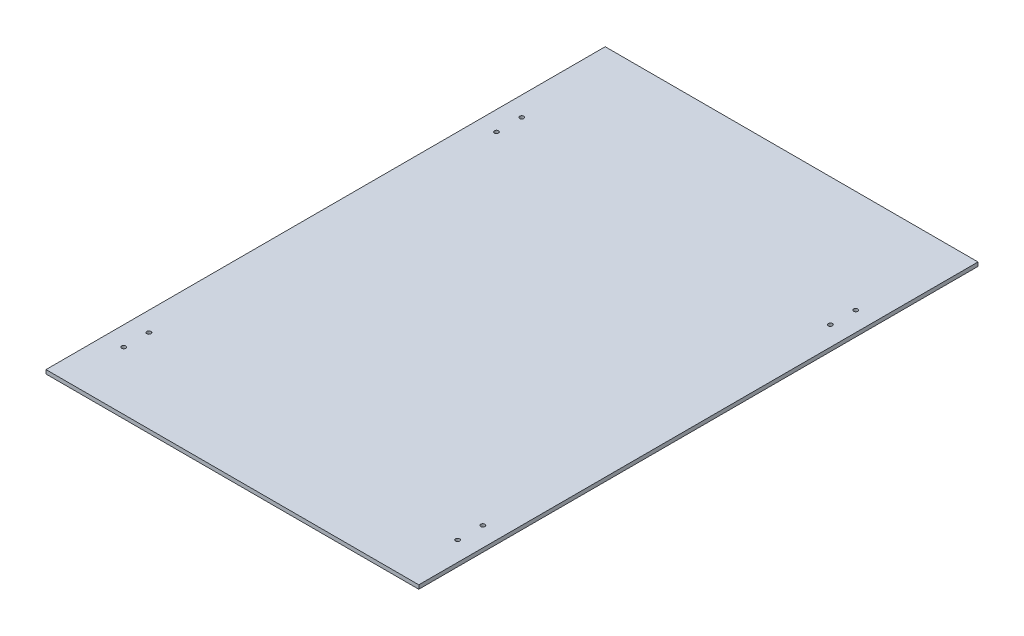
ISO-10303-21;
HEADER;
FILE_DESCRIPTION(('STEP AP214'),'2;1');
FILE_NAME('part.step','',(''),(''),'','','');
FILE_SCHEMA(('AUTOMOTIVE_DESIGN { 1 0 10303 214 1 1 1 1 }'));
ENDSEC;
DATA;
#1=APPLICATION_CONTEXT('core data for automotive mechanical design processes');
#2=APPLICATION_PROTOCOL_DEFINITION('international standard','automotive_design',2000,#1);
#3=PRODUCT_CONTEXT('',#1,'mechanical');
#4=PRODUCT('Part','Part','',(#3));
#5=PRODUCT_RELATED_PRODUCT_CATEGORY('part','',(#4));
#6=PRODUCT_DEFINITION_FORMATION('','',#4);
#7=PRODUCT_DEFINITION_CONTEXT('part definition',#1,'design');
#8=PRODUCT_DEFINITION('design','',#6,#7);
#9=PRODUCT_DEFINITION_SHAPE('','',#8);
#10=(LENGTH_UNIT() NAMED_UNIT(*) SI_UNIT(.MILLI.,.METRE.));
#11=(NAMED_UNIT(*) PLANE_ANGLE_UNIT() SI_UNIT($,.RADIAN.));
#12=(NAMED_UNIT(*) SI_UNIT($,.STERADIAN.) SOLID_ANGLE_UNIT());
#13=UNCERTAINTY_MEASURE_WITH_UNIT(LENGTH_MEASURE(1.E-05),#10,'distance_accuracy_value','');
#14=(GEOMETRIC_REPRESENTATION_CONTEXT(3) GLOBAL_UNCERTAINTY_ASSIGNED_CONTEXT((#13)) GLOBAL_UNIT_ASSIGNED_CONTEXT((#10,
#11,#12)) REPRESENTATION_CONTEXT('',''));
#15=CARTESIAN_POINT('',(0.,0.,0.));
#16=DIRECTION('',(0.,0.,1.));
#17=DIRECTION('',(1.,0.,0.));
#18=AXIS2_PLACEMENT_3D('',#15,#16,#17);
#19=CARTESIAN_POINT('',(0.,0.,0.));
#20=DIRECTION('',(0.,1.,0.));
#21=DIRECTION('',(0.,0.,1.));
#22=AXIS2_PLACEMENT_3D('',#19,#20,#21);
#23=PLANE('',#22);
#24=CARTESIAN_POINT('',(-273.05,0.,-288.925));
#25=DIRECTION('',(0.,1.,0.));
#26=DIRECTION('',(0.,0.,1.));
#27=AXIS2_PLACEMENT_3D('',#24,#25,#26);
#28=CIRCLE('',#27,3.3655);
#29=CARTESIAN_POINT('',(-273.05,0.,-285.5595));
#30=VERTEX_POINT('',#29);
#31=EDGE_CURVE('E102',#30,#30,#28,.T.);
#32=ORIENTED_EDGE('',*,*,#31,.T.);
#33=EDGE_LOOP('',(#32));
#34=FACE_BOUND('',#33,.T.);
#35=CARTESIAN_POINT('',(-273.05,0.,-247.65));
#36=DIRECTION('',(0.,1.,0.));
#37=DIRECTION('',(0.,0.,1.));
#38=AXIS2_PLACEMENT_3D('',#35,#36,#37);
#39=CIRCLE('',#38,3.3655);
#40=CARTESIAN_POINT('',(-273.05,0.,-244.2845));
#41=VERTEX_POINT('',#40);
#42=EDGE_CURVE('E106',#41,#41,#39,.T.);
#43=ORIENTED_EDGE('',*,*,#42,.T.);
#44=EDGE_LOOP('',(#43));
#45=FACE_BOUND('',#44,.T.);
#46=CARTESIAN_POINT('',(-273.05,0.,320.675));
#47=DIRECTION('',(0.,1.,0.));
#48=DIRECTION('',(0.,0.,1.));
#49=AXIS2_PLACEMENT_3D('',#46,#47,#48);
#50=CIRCLE('',#49,3.3655);
#51=CARTESIAN_POINT('',(-273.05,0.,324.0405));
#52=VERTEX_POINT('',#51);
#53=EDGE_CURVE('E109',#52,#52,#50,.T.);
#54=ORIENTED_EDGE('',*,*,#53,.T.);
#55=EDGE_LOOP('',(#54));
#56=FACE_BOUND('',#55,.T.);
#57=CARTESIAN_POINT('',(-273.05,0.,361.95));
#58=DIRECTION('',(0.,1.,0.));
#59=DIRECTION('',(0.,0.,1.));
#60=AXIS2_PLACEMENT_3D('',#57,#58,#59);
#61=CIRCLE('',#60,3.3655);
#62=CARTESIAN_POINT('',(-273.05,0.,365.3155));
#63=VERTEX_POINT('',#62);
#64=EDGE_CURVE('E112',#63,#63,#61,.T.);
#65=ORIENTED_EDGE('',*,*,#64,.T.);
#66=EDGE_LOOP('',(#65));
#67=FACE_BOUND('',#66,.T.);
#68=CARTESIAN_POINT('',(273.05,0.,-288.925));
#69=DIRECTION('',(0.,-1.,0.));
#70=DIRECTION('',(0.,0.,-1.));
#71=AXIS2_PLACEMENT_3D('',#68,#69,#70);
#72=CIRCLE('',#71,3.3655);
#73=CARTESIAN_POINT('',(273.05,0.,-292.2905));
#74=VERTEX_POINT('',#73);
#75=EDGE_CURVE('E115',#74,#74,#72,.F.);
#76=ORIENTED_EDGE('',*,*,#75,.T.);
#77=EDGE_LOOP('',(#76));
#78=FACE_BOUND('',#77,.T.);
#79=CARTESIAN_POINT('',(273.05,0.,-247.65));
#80=DIRECTION('',(0.,-1.,0.));
#81=DIRECTION('',(0.,0.,-1.));
#82=AXIS2_PLACEMENT_3D('',#79,#80,#81);
#83=CIRCLE('',#82,3.3655);
#84=CARTESIAN_POINT('',(273.05,0.,-251.0155));
#85=VERTEX_POINT('',#84);
#86=EDGE_CURVE('E118',#85,#85,#83,.F.);
#87=ORIENTED_EDGE('',*,*,#86,.T.);
#88=EDGE_LOOP('',(#87));
#89=FACE_BOUND('',#88,.T.);
#90=CARTESIAN_POINT('',(273.05,0.,320.675));
#91=DIRECTION('',(0.,-1.,0.));
#92=DIRECTION('',(0.,0.,-1.));
#93=AXIS2_PLACEMENT_3D('',#90,#91,#92);
#94=CIRCLE('',#93,3.3655);
#95=CARTESIAN_POINT('',(273.05,0.,317.3095));
#96=VERTEX_POINT('',#95);
#97=EDGE_CURVE('E120',#96,#96,#94,.F.);
#98=ORIENTED_EDGE('',*,*,#97,.T.);
#99=EDGE_LOOP('',(#98));
#100=FACE_BOUND('',#99,.T.);
#101=CARTESIAN_POINT('',(273.05,0.,361.95));
#102=DIRECTION('',(0.,-1.,0.));
#103=DIRECTION('',(0.,0.,-1.));
#104=AXIS2_PLACEMENT_3D('',#101,#102,#103);
#105=CIRCLE('',#104,3.3655);
#106=CARTESIAN_POINT('',(273.05,0.,358.5845));
#107=VERTEX_POINT('',#106);
#108=EDGE_CURVE('E19',#107,#107,#105,.F.);
#109=ORIENTED_EDGE('',*,*,#108,.T.);
#110=EDGE_LOOP('',(#109));
#111=FACE_BOUND('',#110,.T.);
#112=DIRECTION('',(0.,0.,-1.));
#113=VECTOR('',#112,1.);
#114=CARTESIAN_POINT('',(304.8,0.,457.2));
#115=LINE('',#114,#113);
#116=CARTESIAN_POINT('',(304.8,0.,457.2));
#117=VERTEX_POINT('',#116);
#118=CARTESIAN_POINT('',(304.8,0.,-457.2));
#119=VERTEX_POINT('',#118);
#120=EDGE_CURVE('E129',#117,#119,#115,.T.);
#121=ORIENTED_EDGE('',*,*,#120,.F.);
#122=DIRECTION('',(1.,0.,0.));
#123=VECTOR('',#122,1.);
#124=CARTESIAN_POINT('',(-304.8,0.,457.2));
#125=LINE('',#124,#123);
#126=CARTESIAN_POINT('',(-304.8,0.,457.2));
#127=VERTEX_POINT('',#126);
#128=EDGE_CURVE('E54',#127,#117,#125,.T.);
#129=ORIENTED_EDGE('',*,*,#128,.F.);
#130=DIRECTION('',(0.,0.,1.));
#131=VECTOR('',#130,1.);
#132=CARTESIAN_POINT('',(-304.8,0.,-457.2));
#133=LINE('',#132,#131);
#134=CARTESIAN_POINT('',(-304.8,0.,-457.2));
#135=VERTEX_POINT('',#134);
#136=EDGE_CURVE('E56',#135,#127,#133,.T.);
#137=ORIENTED_EDGE('',*,*,#136,.F.);
#138=DIRECTION('',(-1.,0.,0.));
#139=VECTOR('',#138,1.);
#140=CARTESIAN_POINT('',(304.8,0.,-457.2));
#141=LINE('',#140,#139);
#142=EDGE_CURVE('E58',#119,#135,#141,.T.);
#143=ORIENTED_EDGE('',*,*,#142,.F.);
#144=EDGE_LOOP('',(#121,#129,#137,#143));
#145=FACE_BOUND('',#144,.T.);
#146=ADVANCED_FACE('F16',(#34,#45,#56,#67,#78,#89,#100,#111,#145),#23,.F.);
#147=CARTESIAN_POINT('',(304.8,0.,-457.2));
#148=DIRECTION('',(0.,0.,-1.));
#149=DIRECTION('',(-1.,0.,0.));
#150=AXIS2_PLACEMENT_3D('',#147,#148,#149);
#151=PLANE('',#150);
#152=DIRECTION('',(1.,0.,0.));
#153=VECTOR('',#152,1.);
#154=CARTESIAN_POINT('',(0.,6.35,-457.2));
#155=LINE('',#154,#153);
#156=CARTESIAN_POINT('',(304.8,6.35,-457.2));
#157=VERTEX_POINT('',#156);
#158=CARTESIAN_POINT('',(-304.8,6.35,-457.2));
#159=VERTEX_POINT('',#158);
#160=EDGE_CURVE('E105',#157,#159,#155,.F.);
#161=ORIENTED_EDGE('',*,*,#160,.F.);
#162=DIRECTION('',(0.,1.,0.));
#163=VECTOR('',#162,1.);
#164=CARTESIAN_POINT('',(304.8,0.,-457.2));
#165=LINE('',#164,#163);
#166=EDGE_CURVE('E69',#119,#157,#165,.T.);
#167=ORIENTED_EDGE('',*,*,#166,.F.);
#168=ORIENTED_EDGE('',*,*,#142,.T.);
#169=DIRECTION('',(0.,1.,0.));
#170=VECTOR('',#169,1.);
#171=CARTESIAN_POINT('',(-304.8,0.,-457.2));
#172=LINE('',#171,#170);
#173=EDGE_CURVE('E63',#159,#135,#172,.F.);
#174=ORIENTED_EDGE('',*,*,#173,.F.);
#175=EDGE_LOOP('',(#161,#167,#168,#174));
#176=FACE_BOUND('',#175,.T.);
#177=ADVANCED_FACE('F66',(#176),#151,.T.);
#178=CARTESIAN_POINT('',(-304.8,0.,-457.2));
#179=DIRECTION('',(-1.,0.,0.));
#180=DIRECTION('',(0.,0.,1.));
#181=AXIS2_PLACEMENT_3D('',#178,#179,#180);
#182=PLANE('',#181);
#183=DIRECTION('',(0.,0.,1.));
#184=VECTOR('',#183,1.);
#185=CARTESIAN_POINT('',(-304.8,6.35,0.));
#186=LINE('',#185,#184);
#187=CARTESIAN_POINT('',(-304.8,6.35,457.2));
#188=VERTEX_POINT('',#187);
#189=EDGE_CURVE('E74',#159,#188,#186,.T.);
#190=ORIENTED_EDGE('',*,*,#189,.F.);
#191=ORIENTED_EDGE('',*,*,#173,.T.);
#192=ORIENTED_EDGE('',*,*,#136,.T.);
#193=DIRECTION('',(0.,1.,0.));
#194=VECTOR('',#193,1.);
#195=CARTESIAN_POINT('',(-304.8,0.,457.2));
#196=LINE('',#195,#194);
#197=EDGE_CURVE('E77',#188,#127,#196,.F.);
#198=ORIENTED_EDGE('',*,*,#197,.F.);
#199=EDGE_LOOP('',(#190,#191,#192,#198));
#200=FACE_BOUND('',#199,.T.);
#201=ADVANCED_FACE('F72',(#200),#182,.T.);
#202=CARTESIAN_POINT('',(-304.8,0.,457.2));
#203=DIRECTION('',(0.,0.,1.));
#204=DIRECTION('',(1.,0.,0.));
#205=AXIS2_PLACEMENT_3D('',#202,#203,#204);
#206=PLANE('',#205);
#207=DIRECTION('',(1.,0.,0.));
#208=VECTOR('',#207,1.);
#209=CARTESIAN_POINT('',(0.,6.35,457.2));
#210=LINE('',#209,#208);
#211=CARTESIAN_POINT('',(304.8,6.35,457.2));
#212=VERTEX_POINT('',#211);
#213=EDGE_CURVE('E136',#188,#212,#210,.T.);
#214=ORIENTED_EDGE('',*,*,#213,.F.);
#215=ORIENTED_EDGE('',*,*,#197,.T.);
#216=ORIENTED_EDGE('',*,*,#128,.T.);
#217=DIRECTION('',(0.,1.,0.));
#218=VECTOR('',#217,1.);
#219=CARTESIAN_POINT('',(304.8,0.,457.2));
#220=LINE('',#219,#218);
#221=EDGE_CURVE('E34',#212,#117,#220,.F.);
#222=ORIENTED_EDGE('',*,*,#221,.F.);
#223=EDGE_LOOP('',(#214,#215,#216,#222));
#224=FACE_BOUND('',#223,.T.);
#225=ADVANCED_FACE('F134',(#224),#206,.T.);
#226=CARTESIAN_POINT('',(304.8,0.,457.2));
#227=DIRECTION('',(1.,0.,0.));
#228=DIRECTION('',(0.,0.,-1.));
#229=AXIS2_PLACEMENT_3D('',#226,#227,#228);
#230=PLANE('',#229);
#231=DIRECTION('',(0.,0.,1.));
#232=VECTOR('',#231,1.);
#233=CARTESIAN_POINT('',(304.8,6.35,0.));
#234=LINE('',#233,#232);
#235=EDGE_CURVE('E101',#212,#157,#234,.F.);
#236=ORIENTED_EDGE('',*,*,#235,.F.);
#237=ORIENTED_EDGE('',*,*,#221,.T.);
#238=ORIENTED_EDGE('',*,*,#120,.T.);
#239=ORIENTED_EDGE('',*,*,#166,.T.);
#240=EDGE_LOOP('',(#236,#237,#238,#239));
#241=FACE_BOUND('',#240,.T.);
#242=ADVANCED_FACE('F142',(#241),#230,.T.);
#243=CARTESIAN_POINT('',(273.05,0.,361.95));
#244=DIRECTION('',(0.,-1.,0.));
#245=DIRECTION('',(0.,0.,-1.));
#246=AXIS2_PLACEMENT_3D('',#243,#244,#245);
#247=CYLINDRICAL_SURFACE('',#246,3.3655);
#248=CARTESIAN_POINT('',(273.05,6.35,361.95));
#249=DIRECTION('',(0.,-1.,0.));
#250=DIRECTION('',(0.,0.,-1.));
#251=AXIS2_PLACEMENT_3D('',#248,#249,#250);
#252=CIRCLE('',#251,3.3655);
#253=CARTESIAN_POINT('',(273.05,6.35,358.5845));
#254=VERTEX_POINT('',#253);
#255=EDGE_CURVE('E98',#254,#254,#252,.T.);
#256=ORIENTED_EDGE('',*,*,#255,.F.);
#257=EDGE_LOOP('',(#256));
#258=FACE_BOUND('',#257,.T.);
#259=ORIENTED_EDGE('',*,*,#108,.F.);
#260=EDGE_LOOP('',(#259));
#261=FACE_BOUND('',#260,.T.);
#262=ADVANCED_FACE('F144',(#258,#261),#247,.F.);
#263=CARTESIAN_POINT('',(273.05,0.,320.675));
#264=DIRECTION('',(0.,-1.,0.));
#265=DIRECTION('',(0.,0.,-1.));
#266=AXIS2_PLACEMENT_3D('',#263,#264,#265);
#267=CYLINDRICAL_SURFACE('',#266,3.3655);
#268=CARTESIAN_POINT('',(273.05,6.35,320.675));
#269=DIRECTION('',(0.,-1.,0.));
#270=DIRECTION('',(0.,0.,-1.));
#271=AXIS2_PLACEMENT_3D('',#268,#269,#270);
#272=CIRCLE('',#271,3.3655);
#273=CARTESIAN_POINT('',(273.05,6.35,317.3095));
#274=VERTEX_POINT('',#273);
#275=EDGE_CURVE('E95',#274,#274,#272,.T.);
#276=ORIENTED_EDGE('',*,*,#275,.F.);
#277=EDGE_LOOP('',(#276));
#278=FACE_BOUND('',#277,.T.);
#279=ORIENTED_EDGE('',*,*,#97,.F.);
#280=EDGE_LOOP('',(#279));
#281=FACE_BOUND('',#280,.T.);
#282=ADVANCED_FACE('F151',(#278,#281),#267,.F.);
#283=CARTESIAN_POINT('',(273.05,0.,-247.65));
#284=DIRECTION('',(0.,-1.,0.));
#285=DIRECTION('',(0.,0.,-1.));
#286=AXIS2_PLACEMENT_3D('',#283,#284,#285);
#287=CYLINDRICAL_SURFACE('',#286,3.3655);
#288=CARTESIAN_POINT('',(273.05,6.35,-247.65));
#289=DIRECTION('',(0.,-1.,0.));
#290=DIRECTION('',(0.,0.,-1.));
#291=AXIS2_PLACEMENT_3D('',#288,#289,#290);
#292=CIRCLE('',#291,3.3655);
#293=CARTESIAN_POINT('',(273.05,6.35,-251.0155));
#294=VERTEX_POINT('',#293);
#295=EDGE_CURVE('E92',#294,#294,#292,.T.);
#296=ORIENTED_EDGE('',*,*,#295,.F.);
#297=EDGE_LOOP('',(#296));
#298=FACE_BOUND('',#297,.T.);
#299=ORIENTED_EDGE('',*,*,#86,.F.);
#300=EDGE_LOOP('',(#299));
#301=FACE_BOUND('',#300,.T.);
#302=ADVANCED_FACE('F181',(#298,#301),#287,.F.);
#303=CARTESIAN_POINT('',(273.05,0.,-288.925));
#304=DIRECTION('',(0.,-1.,0.));
#305=DIRECTION('',(0.,0.,-1.));
#306=AXIS2_PLACEMENT_3D('',#303,#304,#305);
#307=CYLINDRICAL_SURFACE('',#306,3.3655);
#308=CARTESIAN_POINT('',(273.05,6.35,-288.925));
#309=DIRECTION('',(0.,-1.,0.));
#310=DIRECTION('',(0.,0.,-1.));
#311=AXIS2_PLACEMENT_3D('',#308,#309,#310);
#312=CIRCLE('',#311,3.3655);
#313=CARTESIAN_POINT('',(273.05,6.35,-292.2905));
#314=VERTEX_POINT('',#313);
#315=EDGE_CURVE('E89',#314,#314,#312,.T.);
#316=ORIENTED_EDGE('',*,*,#315,.F.);
#317=EDGE_LOOP('',(#316));
#318=FACE_BOUND('',#317,.T.);
#319=ORIENTED_EDGE('',*,*,#75,.F.);
#320=EDGE_LOOP('',(#319));
#321=FACE_BOUND('',#320,.T.);
#322=ADVANCED_FACE('F177',(#318,#321),#307,.F.);
#323=CARTESIAN_POINT('',(-273.05,0.,361.95));
#324=DIRECTION('',(0.,1.,0.));
#325=DIRECTION('',(0.,0.,1.));
#326=AXIS2_PLACEMENT_3D('',#323,#324,#325);
#327=CYLINDRICAL_SURFACE('',#326,3.3655);
#328=CARTESIAN_POINT('',(-273.05,6.35,361.95));
#329=DIRECTION('',(0.,1.,0.));
#330=DIRECTION('',(0.,0.,1.));
#331=AXIS2_PLACEMENT_3D('',#328,#329,#330);
#332=CIRCLE('',#331,3.3655);
#333=CARTESIAN_POINT('',(-273.05,6.35,365.3155));
#334=VERTEX_POINT('',#333);
#335=EDGE_CURVE('E86',#334,#334,#332,.F.);
#336=ORIENTED_EDGE('',*,*,#335,.F.);
#337=EDGE_LOOP('',(#336));
#338=FACE_BOUND('',#337,.T.);
#339=ORIENTED_EDGE('',*,*,#64,.F.);
#340=EDGE_LOOP('',(#339));
#341=FACE_BOUND('',#340,.T.);
#342=ADVANCED_FACE('F173',(#338,#341),#327,.F.);
#343=CARTESIAN_POINT('',(-273.05,0.,320.675));
#344=DIRECTION('',(0.,1.,0.));
#345=DIRECTION('',(0.,0.,1.));
#346=AXIS2_PLACEMENT_3D('',#343,#344,#345);
#347=CYLINDRICAL_SURFACE('',#346,3.3655);
#348=CARTESIAN_POINT('',(-273.05,6.35,320.675));
#349=DIRECTION('',(0.,1.,0.));
#350=DIRECTION('',(0.,0.,1.));
#351=AXIS2_PLACEMENT_3D('',#348,#349,#350);
#352=CIRCLE('',#351,3.3655);
#353=CARTESIAN_POINT('',(-273.05,6.35,324.0405));
#354=VERTEX_POINT('',#353);
#355=EDGE_CURVE('E83',#354,#354,#352,.F.);
#356=ORIENTED_EDGE('',*,*,#355,.F.);
#357=EDGE_LOOP('',(#356));
#358=FACE_BOUND('',#357,.T.);
#359=ORIENTED_EDGE('',*,*,#53,.F.);
#360=EDGE_LOOP('',(#359));
#361=FACE_BOUND('',#360,.T.);
#362=ADVANCED_FACE('F169',(#358,#361),#347,.F.);
#363=CARTESIAN_POINT('',(-273.05,0.,-247.65));
#364=DIRECTION('',(0.,1.,0.));
#365=DIRECTION('',(0.,0.,1.));
#366=AXIS2_PLACEMENT_3D('',#363,#364,#365);
#367=CYLINDRICAL_SURFACE('',#366,3.3655);
#368=CARTESIAN_POINT('',(-273.05,6.35,-247.65));
#369=DIRECTION('',(0.,1.,0.));
#370=DIRECTION('',(0.,0.,1.));
#371=AXIS2_PLACEMENT_3D('',#368,#369,#370);
#372=CIRCLE('',#371,3.3655);
#373=CARTESIAN_POINT('',(-273.05,6.35,-244.2845));
#374=VERTEX_POINT('',#373);
#375=EDGE_CURVE('E25',#374,#374,#372,.F.);
#376=ORIENTED_EDGE('',*,*,#375,.F.);
#377=EDGE_LOOP('',(#376));
#378=FACE_BOUND('',#377,.T.);
#379=ORIENTED_EDGE('',*,*,#42,.F.);
#380=EDGE_LOOP('',(#379));
#381=FACE_BOUND('',#380,.T.);
#382=ADVANCED_FACE('F162',(#378,#381),#367,.F.);
#383=CARTESIAN_POINT('',(-273.05,0.,-288.925));
#384=DIRECTION('',(0.,1.,0.));
#385=DIRECTION('',(0.,0.,1.));
#386=AXIS2_PLACEMENT_3D('',#383,#384,#385);
#387=CYLINDRICAL_SURFACE('',#386,3.3655);
#388=CARTESIAN_POINT('',(-273.05,6.35,-288.925));
#389=DIRECTION('',(0.,1.,0.));
#390=DIRECTION('',(0.,0.,1.));
#391=AXIS2_PLACEMENT_3D('',#388,#389,#390);
#392=CIRCLE('',#391,3.3655);
#393=CARTESIAN_POINT('',(-273.05,6.35,-285.5595));
#394=VERTEX_POINT('',#393);
#395=EDGE_CURVE('E11',#394,#394,#392,.F.);
#396=ORIENTED_EDGE('',*,*,#395,.F.);
#397=EDGE_LOOP('',(#396));
#398=FACE_BOUND('',#397,.T.);
#399=ORIENTED_EDGE('',*,*,#31,.F.);
#400=EDGE_LOOP('',(#399));
#401=FACE_BOUND('',#400,.T.);
#402=ADVANCED_FACE('F156',(#398,#401),#387,.F.);
#403=CARTESIAN_POINT('',(0.,6.35,0.));
#404=DIRECTION('',(0.,1.,0.));
#405=DIRECTION('',(0.,0.,1.));
#406=AXIS2_PLACEMENT_3D('',#403,#404,#405);
#407=PLANE('',#406);
#408=ORIENTED_EDGE('',*,*,#395,.T.);
#409=EDGE_LOOP('',(#408));
#410=FACE_BOUND('',#409,.T.);
#411=ORIENTED_EDGE('',*,*,#375,.T.);
#412=EDGE_LOOP('',(#411));
#413=FACE_BOUND('',#412,.T.);
#414=ORIENTED_EDGE('',*,*,#355,.T.);
#415=EDGE_LOOP('',(#414));
#416=FACE_BOUND('',#415,.T.);
#417=ORIENTED_EDGE('',*,*,#335,.T.);
#418=EDGE_LOOP('',(#417));
#419=FACE_BOUND('',#418,.T.);
#420=ORIENTED_EDGE('',*,*,#315,.T.);
#421=EDGE_LOOP('',(#420));
#422=FACE_BOUND('',#421,.T.);
#423=ORIENTED_EDGE('',*,*,#295,.T.);
#424=EDGE_LOOP('',(#423));
#425=FACE_BOUND('',#424,.T.);
#426=ORIENTED_EDGE('',*,*,#275,.T.);
#427=EDGE_LOOP('',(#426));
#428=FACE_BOUND('',#427,.T.);
#429=ORIENTED_EDGE('',*,*,#255,.T.);
#430=EDGE_LOOP('',(#429));
#431=FACE_BOUND('',#430,.T.);
#432=ORIENTED_EDGE('',*,*,#213,.T.);
#433=ORIENTED_EDGE('',*,*,#235,.T.);
#434=ORIENTED_EDGE('',*,*,#160,.T.);
#435=ORIENTED_EDGE('',*,*,#189,.T.);
#436=EDGE_LOOP('',(#432,#433,#434,#435));
#437=FACE_BOUND('',#436,.T.);
#438=ADVANCED_FACE('F140',(#410,#413,#416,#419,#422,#425,#428,#431,#437),#407,.T.);
#439=CLOSED_SHELL('',(#146,#177,#201,#225,#242,#262,#282,#302,#322,#342,#362,#382,#402,#438));
#440=MANIFOLD_SOLID_BREP('B1',#439);
#441=ADVANCED_BREP_SHAPE_REPRESENTATION('',(#18,#440),#14);
#442=SHAPE_DEFINITION_REPRESENTATION(#9,#441);
ENDSEC;
END-ISO-10303-21;
